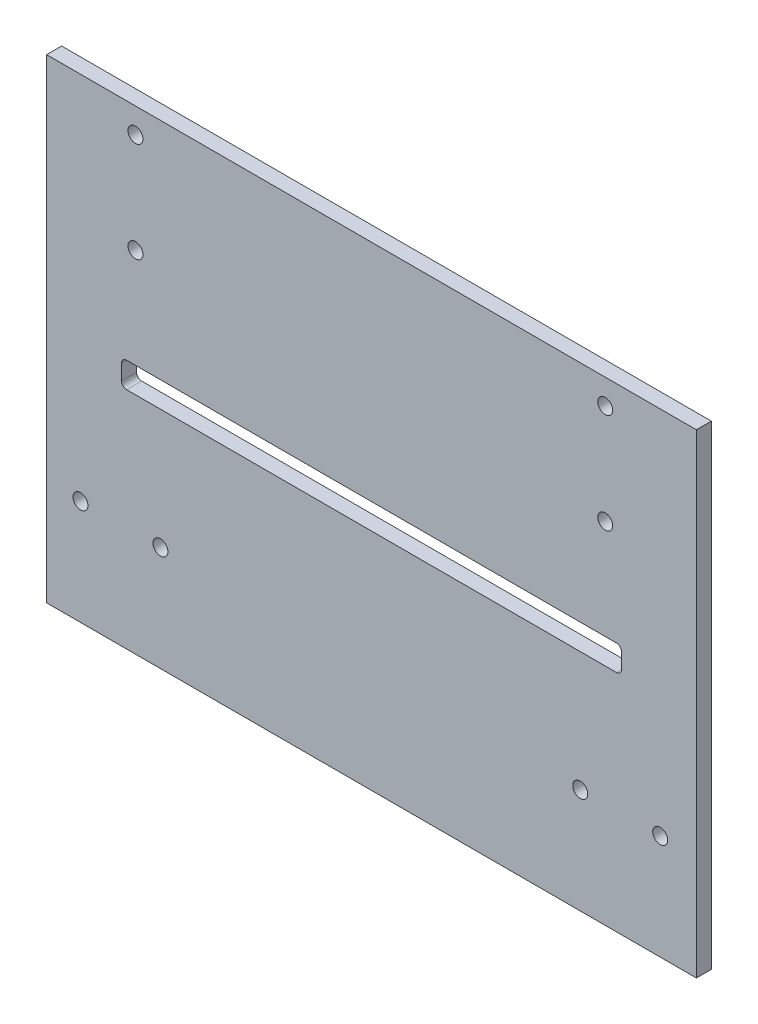
ISO-10303-21;
HEADER;
FILE_DESCRIPTION(('STEP AP214'),'2;1');
FILE_NAME('part.step','',(''),(''),'','','');
FILE_SCHEMA(('AUTOMOTIVE_DESIGN { 1 0 10303 214 1 1 1 1 }'));
ENDSEC;
DATA;
#1=APPLICATION_CONTEXT('core data for automotive mechanical design processes');
#2=APPLICATION_PROTOCOL_DEFINITION('international standard','automotive_design',2000,#1);
#3=PRODUCT_CONTEXT('',#1,'mechanical');
#4=PRODUCT('Part','Part','',(#3));
#5=PRODUCT_RELATED_PRODUCT_CATEGORY('part','',(#4));
#6=PRODUCT_DEFINITION_FORMATION('','',#4);
#7=PRODUCT_DEFINITION_CONTEXT('part definition',#1,'design');
#8=PRODUCT_DEFINITION('design','',#6,#7);
#9=PRODUCT_DEFINITION_SHAPE('','',#8);
#10=(LENGTH_UNIT() NAMED_UNIT(*) SI_UNIT(.MILLI.,.METRE.));
#11=(NAMED_UNIT(*) PLANE_ANGLE_UNIT() SI_UNIT($,.RADIAN.));
#12=(NAMED_UNIT(*) SI_UNIT($,.STERADIAN.) SOLID_ANGLE_UNIT());
#13=UNCERTAINTY_MEASURE_WITH_UNIT(LENGTH_MEASURE(1.E-05),#10,'distance_accuracy_value','');
#14=(GEOMETRIC_REPRESENTATION_CONTEXT(3) GLOBAL_UNCERTAINTY_ASSIGNED_CONTEXT((#13)) GLOBAL_UNIT_ASSIGNED_CONTEXT((#10,
#11,#12)) REPRESENTATION_CONTEXT('',''));
#15=CARTESIAN_POINT('',(0.,0.,0.));
#16=DIRECTION('',(0.,0.,1.));
#17=DIRECTION('',(1.,0.,0.));
#18=AXIS2_PLACEMENT_3D('',#15,#16,#17);
#19=CARTESIAN_POINT('',(-65.,-47.5,3.));
#20=DIRECTION('',(1.,0.,0.));
#21=DIRECTION('',(0.,0.,-1.));
#22=AXIS2_PLACEMENT_3D('',#19,#20,#21);
#23=PLANE('',#22);
#24=DIRECTION('',(0.,-1.,0.));
#25=VECTOR('',#24,1.);
#26=CARTESIAN_POINT('',(-65.,-47.5,0.));
#27=LINE('',#26,#25);
#28=CARTESIAN_POINT('',(-65.,47.5,0.));
#29=VERTEX_POINT('',#28);
#30=CARTESIAN_POINT('',(-65.,-47.5,0.));
#31=VERTEX_POINT('',#30);
#32=EDGE_CURVE('E157',#29,#31,#27,.T.);
#33=ORIENTED_EDGE('',*,*,#32,.T.);
#34=DIRECTION('',(0.,0.,-1.));
#35=VECTOR('',#34,1.);
#36=CARTESIAN_POINT('',(-65.,-47.5,3.));
#37=LINE('',#36,#35);
#38=CARTESIAN_POINT('',(-65.,-47.5,3.));
#39=VERTEX_POINT('',#38);
#40=EDGE_CURVE('E136',#39,#31,#37,.T.);
#41=ORIENTED_EDGE('',*,*,#40,.F.);
#42=DIRECTION('',(0.,-1.,0.));
#43=VECTOR('',#42,1.);
#44=CARTESIAN_POINT('',(-65.,-47.5,3.));
#45=LINE('',#44,#43);
#46=CARTESIAN_POINT('',(-65.,47.5,3.));
#47=VERTEX_POINT('',#46);
#48=EDGE_CURVE('E144',#47,#39,#45,.T.);
#49=ORIENTED_EDGE('',*,*,#48,.F.);
#50=DIRECTION('',(0.,0.,-1.));
#51=VECTOR('',#50,1.);
#52=CARTESIAN_POINT('',(-65.,47.5,3.));
#53=LINE('',#52,#51);
#54=EDGE_CURVE('E328',#47,#29,#53,.T.);
#55=ORIENTED_EDGE('',*,*,#54,.T.);
#56=EDGE_LOOP('',(#33,#41,#49,#55));
#57=FACE_BOUND('',#56,.T.);
#58=ADVANCED_FACE('F42',(#57),#23,.F.);
#59=CARTESIAN_POINT('',(65.,-47.5,3.));
#60=DIRECTION('',(0.,1.,0.));
#61=DIRECTION('',(-1.,0.,0.));
#62=AXIS2_PLACEMENT_3D('',#59,#60,#61);
#63=PLANE('',#62);
#64=DIRECTION('',(1.,0.,0.));
#65=VECTOR('',#64,1.);
#66=CARTESIAN_POINT('',(65.,-47.5,0.));
#67=LINE('',#66,#65);
#68=CARTESIAN_POINT('',(65.,-47.5,0.));
#69=VERTEX_POINT('',#68);
#70=EDGE_CURVE('E331',#31,#69,#67,.T.);
#71=ORIENTED_EDGE('',*,*,#70,.T.);
#72=DIRECTION('',(0.,0.,-1.));
#73=VECTOR('',#72,1.);
#74=CARTESIAN_POINT('',(65.,-47.5,3.));
#75=LINE('',#74,#73);
#76=CARTESIAN_POINT('',(65.,-47.5,3.));
#77=VERTEX_POINT('',#76);
#78=EDGE_CURVE('E139',#77,#69,#75,.T.);
#79=ORIENTED_EDGE('',*,*,#78,.F.);
#80=DIRECTION('',(1.,0.,0.));
#81=VECTOR('',#80,1.);
#82=CARTESIAN_POINT('',(65.,-47.5,3.));
#83=LINE('',#82,#81);
#84=EDGE_CURVE('E132',#39,#77,#83,.T.);
#85=ORIENTED_EDGE('',*,*,#84,.F.);
#86=ORIENTED_EDGE('',*,*,#40,.T.);
#87=EDGE_LOOP('',(#71,#79,#85,#86));
#88=FACE_BOUND('',#87,.T.);
#89=ADVANCED_FACE('F134',(#88),#63,.F.);
#90=CARTESIAN_POINT('',(65.,-47.5,3.));
#91=DIRECTION('',(-1.,0.,0.));
#92=DIRECTION('',(0.,0.,1.));
#93=AXIS2_PLACEMENT_3D('',#90,#91,#92);
#94=PLANE('',#93);
#95=DIRECTION('',(0.,1.,0.));
#96=VECTOR('',#95,1.);
#97=CARTESIAN_POINT('',(65.,-47.5,0.));
#98=LINE('',#97,#96);
#99=CARTESIAN_POINT('',(65.,47.5,0.));
#100=VERTEX_POINT('',#99);
#101=EDGE_CURVE('E334',#69,#100,#98,.T.);
#102=ORIENTED_EDGE('',*,*,#101,.T.);
#103=DIRECTION('',(0.,0.,-1.));
#104=VECTOR('',#103,1.);
#105=CARTESIAN_POINT('',(65.,47.5,3.));
#106=LINE('',#105,#104);
#107=CARTESIAN_POINT('',(65.,47.5,3.));
#108=VERTEX_POINT('',#107);
#109=EDGE_CURVE('E166',#108,#100,#106,.T.);
#110=ORIENTED_EDGE('',*,*,#109,.F.);
#111=DIRECTION('',(0.,1.,0.));
#112=VECTOR('',#111,1.);
#113=CARTESIAN_POINT('',(65.,-47.5,3.));
#114=LINE('',#113,#112);
#115=EDGE_CURVE('E143',#77,#108,#114,.T.);
#116=ORIENTED_EDGE('',*,*,#115,.F.);
#117=ORIENTED_EDGE('',*,*,#78,.T.);
#118=EDGE_LOOP('',(#102,#110,#116,#117));
#119=FACE_BOUND('',#118,.T.);
#120=ADVANCED_FACE('F349',(#119),#94,.F.);
#121=CARTESIAN_POINT('',(65.,47.5,3.));
#122=DIRECTION('',(0.,-1.,0.));
#123=DIRECTION('',(1.,0.,0.));
#124=AXIS2_PLACEMENT_3D('',#121,#122,#123);
#125=PLANE('',#124);
#126=DIRECTION('',(-1.,0.,0.));
#127=VECTOR('',#126,1.);
#128=CARTESIAN_POINT('',(65.,47.5,0.));
#129=LINE('',#128,#127);
#130=EDGE_CURVE('E154',#100,#29,#129,.T.);
#131=ORIENTED_EDGE('',*,*,#130,.T.);
#132=ORIENTED_EDGE('',*,*,#54,.F.);
#133=DIRECTION('',(-1.,0.,0.));
#134=VECTOR('',#133,1.);
#135=CARTESIAN_POINT('',(65.,47.5,3.));
#136=LINE('',#135,#134);
#137=EDGE_CURVE('E149',#108,#47,#136,.T.);
#138=ORIENTED_EDGE('',*,*,#137,.F.);
#139=ORIENTED_EDGE('',*,*,#109,.T.);
#140=EDGE_LOOP('',(#131,#132,#138,#139));
#141=FACE_BOUND('',#140,.T.);
#142=ADVANCED_FACE('F345',(#141),#125,.F.);
#143=CARTESIAN_POINT('',(0.,0.,3.));
#144=DIRECTION('',(0.,0.,1.));
#145=DIRECTION('',(1.,0.,0.));
#146=AXIS2_PLACEMENT_3D('',#143,#144,#145);
#147=PLANE('',#146);
#148=DIRECTION('',(0.,-1.,0.));
#149=VECTOR('',#148,1.);
#150=CARTESIAN_POINT('',(-50.,-2.55000000000001,3.));
#151=LINE('',#150,#149);
#152=CARTESIAN_POINT('',(-50.,1.54999999999999,3.));
#153=VERTEX_POINT('',#152);
#154=CARTESIAN_POINT('',(-50.,-1.55000000000001,3.));
#155=VERTEX_POINT('',#154);
#156=EDGE_CURVE('E250',#153,#155,#151,.T.);
#157=ORIENTED_EDGE('',*,*,#156,.F.);
#158=CARTESIAN_POINT('',(-49.,1.54999999999999,3.));
#159=DIRECTION('',(0.,0.,1.));
#160=DIRECTION('',(1.,0.,0.));
#161=AXIS2_PLACEMENT_3D('',#158,#159,#160);
#162=CIRCLE('',#161,1.);
#163=CARTESIAN_POINT('',(-49.,2.54999999999999,3.));
#164=VERTEX_POINT('',#163);
#165=EDGE_CURVE('E187',#153,#164,#162,.F.);
#166=ORIENTED_EDGE('',*,*,#165,.T.);
#167=DIRECTION('',(-1.,0.,0.));
#168=VECTOR('',#167,1.);
#169=CARTESIAN_POINT('',(50.,2.55000000000001,3.));
#170=LINE('',#169,#168);
#171=CARTESIAN_POINT('',(49.,2.55000000000001,3.));
#172=VERTEX_POINT('',#171);
#173=EDGE_CURVE('E254',#172,#164,#170,.T.);
#174=ORIENTED_EDGE('',*,*,#173,.F.);
#175=CARTESIAN_POINT('',(49.,1.55000000000001,3.));
#176=DIRECTION('',(0.,0.,1.));
#177=DIRECTION('',(1.,0.,0.));
#178=AXIS2_PLACEMENT_3D('',#175,#176,#177);
#179=CIRCLE('',#178,1.);
#180=CARTESIAN_POINT('',(50.,1.55000000000001,3.));
#181=VERTEX_POINT('',#180);
#182=EDGE_CURVE('E214',#172,#181,#179,.F.);
#183=ORIENTED_EDGE('',*,*,#182,.T.);
#184=DIRECTION('',(0.,1.,0.));
#185=VECTOR('',#184,1.);
#186=CARTESIAN_POINT('',(50.,-2.54999999999999,3.));
#187=LINE('',#186,#185);
#188=CARTESIAN_POINT('',(50.,-1.54999999999999,3.));
#189=VERTEX_POINT('',#188);
#190=EDGE_CURVE('E245',#189,#181,#187,.T.);
#191=ORIENTED_EDGE('',*,*,#190,.F.);
#192=CARTESIAN_POINT('',(49.,-1.54999999999999,3.));
#193=DIRECTION('',(0.,0.,1.));
#194=DIRECTION('',(1.,0.,0.));
#195=AXIS2_PLACEMENT_3D('',#192,#193,#194);
#196=CIRCLE('',#195,1.);
#197=CARTESIAN_POINT('',(49.,-2.54999999999999,3.));
#198=VERTEX_POINT('',#197);
#199=EDGE_CURVE('E220',#189,#198,#196,.F.);
#200=ORIENTED_EDGE('',*,*,#199,.T.);
#201=DIRECTION('',(1.,0.,0.));
#202=VECTOR('',#201,1.);
#203=CARTESIAN_POINT('',(50.,-2.54999999999999,3.));
#204=LINE('',#203,#202);
#205=CARTESIAN_POINT('',(-49.,-2.55000000000001,3.));
#206=VERTEX_POINT('',#205);
#207=EDGE_CURVE('E244',#206,#198,#204,.T.);
#208=ORIENTED_EDGE('',*,*,#207,.F.);
#209=CARTESIAN_POINT('',(-49.,-1.55000000000001,3.));
#210=DIRECTION('',(0.,0.,1.));
#211=DIRECTION('',(1.,0.,0.));
#212=AXIS2_PLACEMENT_3D('',#209,#210,#211);
#213=CIRCLE('',#212,1.);
#214=EDGE_CURVE('E51',#206,#155,#213,.F.);
#215=ORIENTED_EDGE('',*,*,#214,.T.);
#216=EDGE_LOOP('',(#157,#166,#174,#183,#191,#200,#208,#215));
#217=FACE_BOUND('',#216,.T.);
#218=CARTESIAN_POINT('',(46.7671126155352,22.5,3.));
#219=DIRECTION('',(0.,0.,1.));
#220=DIRECTION('',(1.,0.,0.));
#221=AXIS2_PLACEMENT_3D('',#218,#219,#220);
#222=CIRCLE('',#221,1.5);
#223=CARTESIAN_POINT('',(48.2671126155352,22.5,3.));
#224=VERTEX_POINT('',#223);
#225=EDGE_CURVE('E288',#224,#224,#222,.T.);
#226=ORIENTED_EDGE('',*,*,#225,.F.);
#227=EDGE_LOOP('',(#226));
#228=FACE_BOUND('',#227,.T.);
#229=CARTESIAN_POINT('',(-47.2328873844649,42.5,3.));
#230=DIRECTION('',(0.,0.,1.));
#231=DIRECTION('',(1.,0.,0.));
#232=AXIS2_PLACEMENT_3D('',#229,#230,#231);
#233=CIRCLE('',#232,1.5);
#234=CARTESIAN_POINT('',(-45.7328873844649,42.5,3.));
#235=VERTEX_POINT('',#234);
#236=EDGE_CURVE('E284',#235,#235,#233,.T.);
#237=ORIENTED_EDGE('',*,*,#236,.F.);
#238=EDGE_LOOP('',(#237));
#239=FACE_BOUND('',#238,.T.);
#240=CARTESIAN_POINT('',(-47.2328873844649,22.5,3.));
#241=DIRECTION('',(0.,0.,1.));
#242=DIRECTION('',(1.,0.,0.));
#243=AXIS2_PLACEMENT_3D('',#240,#241,#242);
#244=CIRCLE('',#243,1.5);
#245=CARTESIAN_POINT('',(-45.7328873844649,22.5,3.));
#246=VERTEX_POINT('',#245);
#247=EDGE_CURVE('E280',#246,#246,#244,.T.);
#248=ORIENTED_EDGE('',*,*,#247,.F.);
#249=EDGE_LOOP('',(#248));
#250=FACE_BOUND('',#249,.T.);
#251=CARTESIAN_POINT('',(46.7671126155352,42.5,3.));
#252=DIRECTION('',(0.,0.,1.));
#253=DIRECTION('',(1.,0.,0.));
#254=AXIS2_PLACEMENT_3D('',#251,#252,#253);
#255=CIRCLE('',#254,1.5);
#256=CARTESIAN_POINT('',(48.2671126155352,42.5,3.));
#257=VERTEX_POINT('',#256);
#258=EDGE_CURVE('E276',#257,#257,#255,.T.);
#259=ORIENTED_EDGE('',*,*,#258,.F.);
#260=EDGE_LOOP('',(#259));
#261=FACE_BOUND('',#260,.T.);
#262=CARTESIAN_POINT('',(57.7671126155351,-26.5,3.));
#263=DIRECTION('',(0.,0.,1.));
#264=DIRECTION('',(1.,0.,0.));
#265=AXIS2_PLACEMENT_3D('',#262,#263,#264);
#266=CIRCLE('',#265,1.5);
#267=CARTESIAN_POINT('',(59.2671126155351,-26.5,3.));
#268=VERTEX_POINT('',#267);
#269=EDGE_CURVE('E320',#268,#268,#266,.T.);
#270=ORIENTED_EDGE('',*,*,#269,.F.);
#271=EDGE_LOOP('',(#270));
#272=FACE_BOUND('',#271,.T.);
#273=CARTESIAN_POINT('',(41.7671126155351,-26.5,3.));
#274=DIRECTION('',(0.,0.,1.));
#275=DIRECTION('',(1.,0.,0.));
#276=AXIS2_PLACEMENT_3D('',#273,#274,#275);
#277=CIRCLE('',#276,1.5);
#278=CARTESIAN_POINT('',(43.2671126155351,-26.5,3.));
#279=VERTEX_POINT('',#278);
#280=EDGE_CURVE('E316',#279,#279,#277,.T.);
#281=ORIENTED_EDGE('',*,*,#280,.F.);
#282=EDGE_LOOP('',(#281));
#283=FACE_BOUND('',#282,.T.);
#284=CARTESIAN_POINT('',(-42.2328873844649,-26.5,3.));
#285=DIRECTION('',(0.,0.,1.));
#286=DIRECTION('',(1.,0.,0.));
#287=AXIS2_PLACEMENT_3D('',#284,#285,#286);
#288=CIRCLE('',#287,1.5);
#289=CARTESIAN_POINT('',(-40.7328873844649,-26.5,3.));
#290=VERTEX_POINT('',#289);
#291=EDGE_CURVE('E312',#290,#290,#288,.T.);
#292=ORIENTED_EDGE('',*,*,#291,.F.);
#293=EDGE_LOOP('',(#292));
#294=FACE_BOUND('',#293,.T.);
#295=CARTESIAN_POINT('',(-58.2328873844649,-26.5,3.));
#296=DIRECTION('',(0.,0.,1.));
#297=DIRECTION('',(1.,0.,0.));
#298=AXIS2_PLACEMENT_3D('',#295,#296,#297);
#299=CIRCLE('',#298,1.5);
#300=CARTESIAN_POINT('',(-56.7328873844649,-26.5,3.));
#301=VERTEX_POINT('',#300);
#302=EDGE_CURVE('E297',#301,#301,#299,.T.);
#303=ORIENTED_EDGE('',*,*,#302,.F.);
#304=EDGE_LOOP('',(#303));
#305=FACE_BOUND('',#304,.T.);
#306=ORIENTED_EDGE('',*,*,#48,.T.);
#307=ORIENTED_EDGE('',*,*,#84,.T.);
#308=ORIENTED_EDGE('',*,*,#115,.T.);
#309=ORIENTED_EDGE('',*,*,#137,.T.);
#310=EDGE_LOOP('',(#306,#307,#308,#309));
#311=FACE_BOUND('',#310,.T.);
#312=ADVANCED_FACE('F147',(#217,#228,#239,#250,#261,#272,#283,#294,#305,#311),#147,.T.);
#313=CARTESIAN_POINT('',(0.,0.,0.));
#314=DIRECTION('',(0.,0.,1.));
#315=DIRECTION('',(1.,0.,0.));
#316=AXIS2_PLACEMENT_3D('',#313,#314,#315);
#317=PLANE('',#316);
#318=DIRECTION('',(0.,1.,0.));
#319=VECTOR('',#318,1.);
#320=CARTESIAN_POINT('',(50.,0.,0.));
#321=LINE('',#320,#319);
#322=CARTESIAN_POINT('',(50.,-1.54999999999999,0.));
#323=VERTEX_POINT('',#322);
#324=CARTESIAN_POINT('',(50.,1.55000000000001,0.));
#325=VERTEX_POINT('',#324);
#326=EDGE_CURVE('E164',#323,#325,#321,.T.);
#327=ORIENTED_EDGE('',*,*,#326,.T.);
#328=CARTESIAN_POINT('',(49.,1.55000000000001,0.));
#329=DIRECTION('',(0.,0.,1.));
#330=DIRECTION('',(1.,0.,0.));
#331=AXIS2_PLACEMENT_3D('',#328,#329,#330);
#332=CIRCLE('',#331,1.);
#333=CARTESIAN_POINT('',(49.,2.55000000000001,0.));
#334=VERTEX_POINT('',#333);
#335=EDGE_CURVE('E217',#325,#334,#332,.T.);
#336=ORIENTED_EDGE('',*,*,#335,.T.);
#337=DIRECTION('',(-1.,0.,0.));
#338=VECTOR('',#337,1.);
#339=CARTESIAN_POINT('',(0.,2.55,0.));
#340=LINE('',#339,#338);
#341=CARTESIAN_POINT('',(-49.,2.54999999999999,0.));
#342=VERTEX_POINT('',#341);
#343=EDGE_CURVE('E173',#334,#342,#340,.T.);
#344=ORIENTED_EDGE('',*,*,#343,.T.);
#345=CARTESIAN_POINT('',(-49.,1.54999999999999,0.));
#346=DIRECTION('',(0.,0.,1.));
#347=DIRECTION('',(1.,0.,0.));
#348=AXIS2_PLACEMENT_3D('',#345,#346,#347);
#349=CIRCLE('',#348,1.);
#350=CARTESIAN_POINT('',(-50.,1.54999999999999,0.));
#351=VERTEX_POINT('',#350);
#352=EDGE_CURVE('E191',#342,#351,#349,.T.);
#353=ORIENTED_EDGE('',*,*,#352,.T.);
#354=DIRECTION('',(0.,-1.,0.));
#355=VECTOR('',#354,1.);
#356=CARTESIAN_POINT('',(-50.,0.,0.));
#357=LINE('',#356,#355);
#358=CARTESIAN_POINT('',(-50.,-1.55000000000001,0.));
#359=VERTEX_POINT('',#358);
#360=EDGE_CURVE('E176',#351,#359,#357,.T.);
#361=ORIENTED_EDGE('',*,*,#360,.T.);
#362=CARTESIAN_POINT('',(-49.,-1.55000000000001,0.));
#363=DIRECTION('',(0.,0.,1.));
#364=DIRECTION('',(1.,0.,0.));
#365=AXIS2_PLACEMENT_3D('',#362,#363,#364);
#366=CIRCLE('',#365,1.);
#367=CARTESIAN_POINT('',(-49.,-2.55000000000001,0.));
#368=VERTEX_POINT('',#367);
#369=EDGE_CURVE('E11',#359,#368,#366,.T.);
#370=ORIENTED_EDGE('',*,*,#369,.T.);
#371=DIRECTION('',(1.,0.,0.));
#372=VECTOR('',#371,1.);
#373=CARTESIAN_POINT('',(0.,-2.55,0.));
#374=LINE('',#373,#372);
#375=CARTESIAN_POINT('',(49.,-2.54999999999999,0.));
#376=VERTEX_POINT('',#375);
#377=EDGE_CURVE('E159',#368,#376,#374,.T.);
#378=ORIENTED_EDGE('',*,*,#377,.T.);
#379=CARTESIAN_POINT('',(49.,-1.54999999999999,0.));
#380=DIRECTION('',(0.,0.,1.));
#381=DIRECTION('',(1.,0.,0.));
#382=AXIS2_PLACEMENT_3D('',#379,#380,#381);
#383=CIRCLE('',#382,1.);
#384=EDGE_CURVE('E223',#376,#323,#383,.T.);
#385=ORIENTED_EDGE('',*,*,#384,.T.);
#386=EDGE_LOOP('',(#327,#336,#344,#353,#361,#370,#378,#385));
#387=FACE_BOUND('',#386,.T.);
#388=CARTESIAN_POINT('',(46.7671126155352,22.5,0.));
#389=DIRECTION('',(0.,0.,-1.));
#390=DIRECTION('',(-1.,0.,0.));
#391=AXIS2_PLACEMENT_3D('',#388,#389,#390);
#392=CIRCLE('',#391,1.5);
#393=CARTESIAN_POINT('',(45.2671126155352,22.5,0.));
#394=VERTEX_POINT('',#393);
#395=EDGE_CURVE('E265',#394,#394,#392,.T.);
#396=ORIENTED_EDGE('',*,*,#395,.F.);
#397=EDGE_LOOP('',(#396));
#398=FACE_BOUND('',#397,.T.);
#399=CARTESIAN_POINT('',(-47.2328873844649,42.5,0.));
#400=DIRECTION('',(0.,0.,-1.));
#401=DIRECTION('',(-1.,0.,0.));
#402=AXIS2_PLACEMENT_3D('',#399,#400,#401);
#403=CIRCLE('',#402,1.5);
#404=CARTESIAN_POINT('',(-48.7328873844649,42.5,0.));
#405=VERTEX_POINT('',#404);
#406=EDGE_CURVE('E264',#405,#405,#403,.T.);
#407=ORIENTED_EDGE('',*,*,#406,.F.);
#408=EDGE_LOOP('',(#407));
#409=FACE_BOUND('',#408,.T.);
#410=CARTESIAN_POINT('',(-47.2328873844649,22.5,0.));
#411=DIRECTION('',(0.,0.,-1.));
#412=DIRECTION('',(-1.,0.,0.));
#413=AXIS2_PLACEMENT_3D('',#410,#411,#412);
#414=CIRCLE('',#413,1.5);
#415=CARTESIAN_POINT('',(-48.7328873844649,22.5,0.));
#416=VERTEX_POINT('',#415);
#417=EDGE_CURVE('E260',#416,#416,#414,.T.);
#418=ORIENTED_EDGE('',*,*,#417,.F.);
#419=EDGE_LOOP('',(#418));
#420=FACE_BOUND('',#419,.T.);
#421=CARTESIAN_POINT('',(46.7671126155352,42.5,0.));
#422=DIRECTION('',(0.,0.,-1.));
#423=DIRECTION('',(-1.,0.,0.));
#424=AXIS2_PLACEMENT_3D('',#421,#422,#423);
#425=CIRCLE('',#424,1.5);
#426=CARTESIAN_POINT('',(45.2671126155352,42.5,0.));
#427=VERTEX_POINT('',#426);
#428=EDGE_CURVE('E269',#427,#427,#425,.T.);
#429=ORIENTED_EDGE('',*,*,#428,.F.);
#430=EDGE_LOOP('',(#429));
#431=FACE_BOUND('',#430,.T.);
#432=CARTESIAN_POINT('',(57.7671126155351,-26.5,0.));
#433=DIRECTION('',(0.,0.,-1.));
#434=DIRECTION('',(-1.,0.,0.));
#435=AXIS2_PLACEMENT_3D('',#432,#433,#434);
#436=CIRCLE('',#435,1.5);
#437=CARTESIAN_POINT('',(56.2671126155351,-26.5,0.));
#438=VERTEX_POINT('',#437);
#439=EDGE_CURVE('E293',#438,#438,#436,.T.);
#440=ORIENTED_EDGE('',*,*,#439,.F.);
#441=EDGE_LOOP('',(#440));
#442=FACE_BOUND('',#441,.T.);
#443=CARTESIAN_POINT('',(41.7671126155351,-26.5,0.));
#444=DIRECTION('',(0.,0.,-1.));
#445=DIRECTION('',(-1.,0.,0.));
#446=AXIS2_PLACEMENT_3D('',#443,#444,#445);
#447=CIRCLE('',#446,1.5);
#448=CARTESIAN_POINT('',(40.2671126155351,-26.5,0.));
#449=VERTEX_POINT('',#448);
#450=EDGE_CURVE('E298',#449,#449,#447,.T.);
#451=ORIENTED_EDGE('',*,*,#450,.F.);
#452=EDGE_LOOP('',(#451));
#453=FACE_BOUND('',#452,.T.);
#454=CARTESIAN_POINT('',(-42.2328873844649,-26.5,0.));
#455=DIRECTION('',(0.,0.,-1.));
#456=DIRECTION('',(-1.,0.,0.));
#457=AXIS2_PLACEMENT_3D('',#454,#455,#456);
#458=CIRCLE('',#457,1.5);
#459=CARTESIAN_POINT('',(-43.7328873844649,-26.5,0.));
#460=VERTEX_POINT('',#459);
#461=EDGE_CURVE('E302',#460,#460,#458,.T.);
#462=ORIENTED_EDGE('',*,*,#461,.F.);
#463=EDGE_LOOP('',(#462));
#464=FACE_BOUND('',#463,.T.);
#465=CARTESIAN_POINT('',(-58.2328873844649,-26.5,0.));
#466=DIRECTION('',(0.,0.,-1.));
#467=DIRECTION('',(-1.,0.,0.));
#468=AXIS2_PLACEMENT_3D('',#465,#466,#467);
#469=CIRCLE('',#468,1.5);
#470=CARTESIAN_POINT('',(-59.7328873844649,-26.5,0.));
#471=VERTEX_POINT('',#470);
#472=EDGE_CURVE('E292',#471,#471,#469,.T.);
#473=ORIENTED_EDGE('',*,*,#472,.F.);
#474=EDGE_LOOP('',(#473));
#475=FACE_BOUND('',#474,.T.);
#476=ORIENTED_EDGE('',*,*,#32,.F.);
#477=ORIENTED_EDGE('',*,*,#130,.F.);
#478=ORIENTED_EDGE('',*,*,#101,.F.);
#479=ORIENTED_EDGE('',*,*,#70,.F.);
#480=EDGE_LOOP('',(#476,#477,#478,#479));
#481=FACE_BOUND('',#480,.T.);
#482=ADVANCED_FACE('F229',(#387,#398,#409,#420,#431,#442,#453,#464,#475,#481),#317,.F.);
#483=CARTESIAN_POINT('',(-58.2328873844649,-26.5,10.));
#484=DIRECTION('',(0.,0.,-1.));
#485=DIRECTION('',(-1.,0.,0.));
#486=AXIS2_PLACEMENT_3D('',#483,#484,#485);
#487=CYLINDRICAL_SURFACE('',#486,1.5);
#488=ORIENTED_EDGE('',*,*,#302,.T.);
#489=EDGE_LOOP('',(#488));
#490=FACE_BOUND('',#489,.T.);
#491=ORIENTED_EDGE('',*,*,#472,.T.);
#492=EDGE_LOOP('',(#491));
#493=FACE_BOUND('',#492,.T.);
#494=ADVANCED_FACE('F425',(#490,#493),#487,.F.);
#495=CARTESIAN_POINT('',(-42.2328873844649,-26.5,10.));
#496=DIRECTION('',(0.,0.,-1.));
#497=DIRECTION('',(-1.,0.,0.));
#498=AXIS2_PLACEMENT_3D('',#495,#496,#497);
#499=CYLINDRICAL_SURFACE('',#498,1.5);
#500=ORIENTED_EDGE('',*,*,#291,.T.);
#501=EDGE_LOOP('',(#500));
#502=FACE_BOUND('',#501,.T.);
#503=ORIENTED_EDGE('',*,*,#461,.T.);
#504=EDGE_LOOP('',(#503));
#505=FACE_BOUND('',#504,.T.);
#506=ADVANCED_FACE('F421',(#502,#505),#499,.F.);
#507=CARTESIAN_POINT('',(41.7671126155351,-26.5,10.));
#508=DIRECTION('',(0.,0.,-1.));
#509=DIRECTION('',(-1.,0.,0.));
#510=AXIS2_PLACEMENT_3D('',#507,#508,#509);
#511=CYLINDRICAL_SURFACE('',#510,1.5);
#512=ORIENTED_EDGE('',*,*,#280,.T.);
#513=EDGE_LOOP('',(#512));
#514=FACE_BOUND('',#513,.T.);
#515=ORIENTED_EDGE('',*,*,#450,.T.);
#516=EDGE_LOOP('',(#515));
#517=FACE_BOUND('',#516,.T.);
#518=ADVANCED_FACE('F417',(#514,#517),#511,.F.);
#519=CARTESIAN_POINT('',(57.7671126155351,-26.5,10.));
#520=DIRECTION('',(0.,0.,-1.));
#521=DIRECTION('',(-1.,0.,0.));
#522=AXIS2_PLACEMENT_3D('',#519,#520,#521);
#523=CYLINDRICAL_SURFACE('',#522,1.5);
#524=ORIENTED_EDGE('',*,*,#269,.T.);
#525=EDGE_LOOP('',(#524));
#526=FACE_BOUND('',#525,.T.);
#527=ORIENTED_EDGE('',*,*,#439,.T.);
#528=EDGE_LOOP('',(#527));
#529=FACE_BOUND('',#528,.T.);
#530=ADVANCED_FACE('F413',(#526,#529),#523,.F.);
#531=CARTESIAN_POINT('',(46.7671126155352,42.5,10.));
#532=DIRECTION('',(0.,0.,-1.));
#533=DIRECTION('',(-1.,0.,0.));
#534=AXIS2_PLACEMENT_3D('',#531,#532,#533);
#535=CYLINDRICAL_SURFACE('',#534,1.5);
#536=ORIENTED_EDGE('',*,*,#258,.T.);
#537=EDGE_LOOP('',(#536));
#538=FACE_BOUND('',#537,.T.);
#539=ORIENTED_EDGE('',*,*,#428,.T.);
#540=EDGE_LOOP('',(#539));
#541=FACE_BOUND('',#540,.T.);
#542=ADVANCED_FACE('F403',(#538,#541),#535,.F.);
#543=CARTESIAN_POINT('',(-47.2328873844649,22.5,10.));
#544=DIRECTION('',(0.,0.,-1.));
#545=DIRECTION('',(-1.,0.,0.));
#546=AXIS2_PLACEMENT_3D('',#543,#544,#545);
#547=CYLINDRICAL_SURFACE('',#546,1.5);
#548=ORIENTED_EDGE('',*,*,#247,.T.);
#549=EDGE_LOOP('',(#548));
#550=FACE_BOUND('',#549,.T.);
#551=ORIENTED_EDGE('',*,*,#417,.T.);
#552=EDGE_LOOP('',(#551));
#553=FACE_BOUND('',#552,.T.);
#554=ADVANCED_FACE('F399',(#550,#553),#547,.F.);
#555=CARTESIAN_POINT('',(-47.2328873844649,42.5,10.));
#556=DIRECTION('',(0.,0.,-1.));
#557=DIRECTION('',(-1.,0.,0.));
#558=AXIS2_PLACEMENT_3D('',#555,#556,#557);
#559=CYLINDRICAL_SURFACE('',#558,1.5);
#560=ORIENTED_EDGE('',*,*,#236,.T.);
#561=EDGE_LOOP('',(#560));
#562=FACE_BOUND('',#561,.T.);
#563=ORIENTED_EDGE('',*,*,#406,.T.);
#564=EDGE_LOOP('',(#563));
#565=FACE_BOUND('',#564,.T.);
#566=ADVANCED_FACE('F402',(#562,#565),#559,.F.);
#567=CARTESIAN_POINT('',(46.7671126155352,22.5,10.));
#568=DIRECTION('',(0.,0.,-1.));
#569=DIRECTION('',(-1.,0.,0.));
#570=AXIS2_PLACEMENT_3D('',#567,#568,#569);
#571=CYLINDRICAL_SURFACE('',#570,1.5);
#572=ORIENTED_EDGE('',*,*,#225,.T.);
#573=EDGE_LOOP('',(#572));
#574=FACE_BOUND('',#573,.T.);
#575=ORIENTED_EDGE('',*,*,#395,.T.);
#576=EDGE_LOOP('',(#575));
#577=FACE_BOUND('',#576,.T.);
#578=ADVANCED_FACE('F394',(#574,#577),#571,.F.);
#579=CARTESIAN_POINT('',(-50.,-2.55000000000001,-7.));
#580=DIRECTION('',(-1.,0.,0.));
#581=DIRECTION('',(0.,0.,1.));
#582=AXIS2_PLACEMENT_3D('',#579,#580,#581);
#583=PLANE('',#582);
#584=ORIENTED_EDGE('',*,*,#156,.T.);
#585=DIRECTION('',(0.,0.,1.));
#586=VECTOR('',#585,1.);
#587=CARTESIAN_POINT('',(-50.,-1.55000000000001,0.));
#588=LINE('',#587,#586);
#589=EDGE_CURVE('E64',#155,#359,#588,.F.);
#590=ORIENTED_EDGE('',*,*,#589,.T.);
#591=ORIENTED_EDGE('',*,*,#360,.F.);
#592=DIRECTION('',(0.,0.,1.));
#593=VECTOR('',#592,1.);
#594=CARTESIAN_POINT('',(-50.,1.54999999999999,3.));
#595=LINE('',#594,#593);
#596=EDGE_CURVE('E179',#351,#153,#595,.T.);
#597=ORIENTED_EDGE('',*,*,#596,.T.);
#598=EDGE_LOOP('',(#584,#590,#591,#597));
#599=FACE_BOUND('',#598,.T.);
#600=ADVANCED_FACE('F380',(#599),#583,.F.);
#601=CARTESIAN_POINT('',(50.,2.55000000000001,-7.));
#602=DIRECTION('',(0.,1.,0.));
#603=DIRECTION('',(-1.,0.,0.));
#604=AXIS2_PLACEMENT_3D('',#601,#602,#603);
#605=PLANE('',#604);
#606=ORIENTED_EDGE('',*,*,#343,.F.);
#607=DIRECTION('',(0.,0.,1.));
#608=VECTOR('',#607,1.);
#609=CARTESIAN_POINT('',(49.,2.55000000000001,3.));
#610=LINE('',#609,#608);
#611=EDGE_CURVE('E194',#334,#172,#610,.T.);
#612=ORIENTED_EDGE('',*,*,#611,.T.);
#613=ORIENTED_EDGE('',*,*,#173,.T.);
#614=DIRECTION('',(0.,0.,1.));
#615=VECTOR('',#614,1.);
#616=CARTESIAN_POINT('',(-49.,2.54999999999999,0.));
#617=LINE('',#616,#615);
#618=EDGE_CURVE('E183',#164,#342,#617,.F.);
#619=ORIENTED_EDGE('',*,*,#618,.T.);
#620=EDGE_LOOP('',(#606,#612,#613,#619));
#621=FACE_BOUND('',#620,.T.);
#622=ADVANCED_FACE('F385',(#621),#605,.F.);
#623=CARTESIAN_POINT('',(50.,-2.54999999999999,-7.));
#624=DIRECTION('',(1.,0.,0.));
#625=DIRECTION('',(0.,0.,-1.));
#626=AXIS2_PLACEMENT_3D('',#623,#624,#625);
#627=PLANE('',#626);
#628=ORIENTED_EDGE('',*,*,#190,.T.);
#629=DIRECTION('',(0.,0.,1.));
#630=VECTOR('',#629,1.);
#631=CARTESIAN_POINT('',(50.,1.55000000000001,0.));
#632=LINE('',#631,#630);
#633=EDGE_CURVE('E202',#181,#325,#632,.F.);
#634=ORIENTED_EDGE('',*,*,#633,.T.);
#635=ORIENTED_EDGE('',*,*,#326,.F.);
#636=DIRECTION('',(0.,0.,1.));
#637=VECTOR('',#636,1.);
#638=CARTESIAN_POINT('',(50.,-1.54999999999999,3.));
#639=LINE('',#638,#637);
#640=EDGE_CURVE('E198',#323,#189,#639,.T.);
#641=ORIENTED_EDGE('',*,*,#640,.T.);
#642=EDGE_LOOP('',(#628,#634,#635,#641));
#643=FACE_BOUND('',#642,.T.);
#644=ADVANCED_FACE('F238',(#643),#627,.F.);
#645=CARTESIAN_POINT('',(50.,-2.54999999999999,-7.));
#646=DIRECTION('',(0.,-1.,0.));
#647=DIRECTION('',(1.,0.,0.));
#648=AXIS2_PLACEMENT_3D('',#645,#646,#647);
#649=PLANE('',#648);
#650=ORIENTED_EDGE('',*,*,#207,.T.);
#651=DIRECTION('',(0.,0.,1.));
#652=VECTOR('',#651,1.);
#653=CARTESIAN_POINT('',(49.,-2.54999999999999,0.));
#654=LINE('',#653,#652);
#655=EDGE_CURVE('E209',#198,#376,#654,.F.);
#656=ORIENTED_EDGE('',*,*,#655,.T.);
#657=ORIENTED_EDGE('',*,*,#377,.F.);
#658=DIRECTION('',(0.,0.,1.));
#659=VECTOR('',#658,1.);
#660=CARTESIAN_POINT('',(-49.,-2.55000000000001,3.));
#661=LINE('',#660,#659);
#662=EDGE_CURVE('E205',#368,#206,#661,.T.);
#663=ORIENTED_EDGE('',*,*,#662,.T.);
#664=EDGE_LOOP('',(#650,#656,#657,#663));
#665=FACE_BOUND('',#664,.T.);
#666=ADVANCED_FACE('F247',(#665),#649,.F.);
#667=CARTESIAN_POINT('',(-49.,1.54999999999999,-7.));
#668=DIRECTION('',(0.,0.,-1.));
#669=DIRECTION('',(-1.,0.,0.));
#670=AXIS2_PLACEMENT_3D('',#667,#668,#669);
#671=CYLINDRICAL_SURFACE('',#670,1.);
#672=ORIENTED_EDGE('',*,*,#352,.F.);
#673=ORIENTED_EDGE('',*,*,#618,.F.);
#674=ORIENTED_EDGE('',*,*,#165,.F.);
#675=ORIENTED_EDGE('',*,*,#596,.F.);
#676=EDGE_LOOP('',(#672,#673,#674,#675));
#677=FACE_BOUND('',#676,.T.);
#678=ADVANCED_FACE('F363',(#677),#671,.F.);
#679=CARTESIAN_POINT('',(49.,1.55000000000001,-7.));
#680=DIRECTION('',(0.,0.,-1.));
#681=DIRECTION('',(-1.,0.,0.));
#682=AXIS2_PLACEMENT_3D('',#679,#680,#681);
#683=CYLINDRICAL_SURFACE('',#682,1.);
#684=ORIENTED_EDGE('',*,*,#335,.F.);
#685=ORIENTED_EDGE('',*,*,#633,.F.);
#686=ORIENTED_EDGE('',*,*,#182,.F.);
#687=ORIENTED_EDGE('',*,*,#611,.F.);
#688=EDGE_LOOP('',(#684,#685,#686,#687));
#689=FACE_BOUND('',#688,.T.);
#690=ADVANCED_FACE('F366',(#689),#683,.F.);
#691=CARTESIAN_POINT('',(49.,-1.54999999999999,-7.));
#692=DIRECTION('',(0.,0.,-1.));
#693=DIRECTION('',(-1.,0.,0.));
#694=AXIS2_PLACEMENT_3D('',#691,#692,#693);
#695=CYLINDRICAL_SURFACE('',#694,1.);
#696=ORIENTED_EDGE('',*,*,#384,.F.);
#697=ORIENTED_EDGE('',*,*,#655,.F.);
#698=ORIENTED_EDGE('',*,*,#199,.F.);
#699=ORIENTED_EDGE('',*,*,#640,.F.);
#700=EDGE_LOOP('',(#696,#697,#698,#699));
#701=FACE_BOUND('',#700,.T.);
#702=ADVANCED_FACE('F241',(#701),#695,.F.);
#703=CARTESIAN_POINT('',(-49.,-1.55000000000001,-7.));
#704=DIRECTION('',(0.,0.,-1.));
#705=DIRECTION('',(-1.,0.,0.));
#706=AXIS2_PLACEMENT_3D('',#703,#704,#705);
#707=CYLINDRICAL_SURFACE('',#706,1.);
#708=ORIENTED_EDGE('',*,*,#369,.F.);
#709=ORIENTED_EDGE('',*,*,#589,.F.);
#710=ORIENTED_EDGE('',*,*,#214,.F.);
#711=ORIENTED_EDGE('',*,*,#662,.F.);
#712=EDGE_LOOP('',(#708,#709,#710,#711));
#713=FACE_BOUND('',#712,.T.);
#714=ADVANCED_FACE('F44',(#713),#707,.F.);
#715=CLOSED_SHELL('',(#58,#89,#120,#142,#312,#482,#494,#506,#518,#530,#542,#554,#566,#578,#600,
#622,#644,#666,#678,#690,#702,#714));
#716=MANIFOLD_SOLID_BREP('B2',#715);
#717=ADVANCED_BREP_SHAPE_REPRESENTATION('',(#18,#716),#14);
#718=SHAPE_DEFINITION_REPRESENTATION(#9,#717);
ENDSEC;
END-ISO-10303-21;
